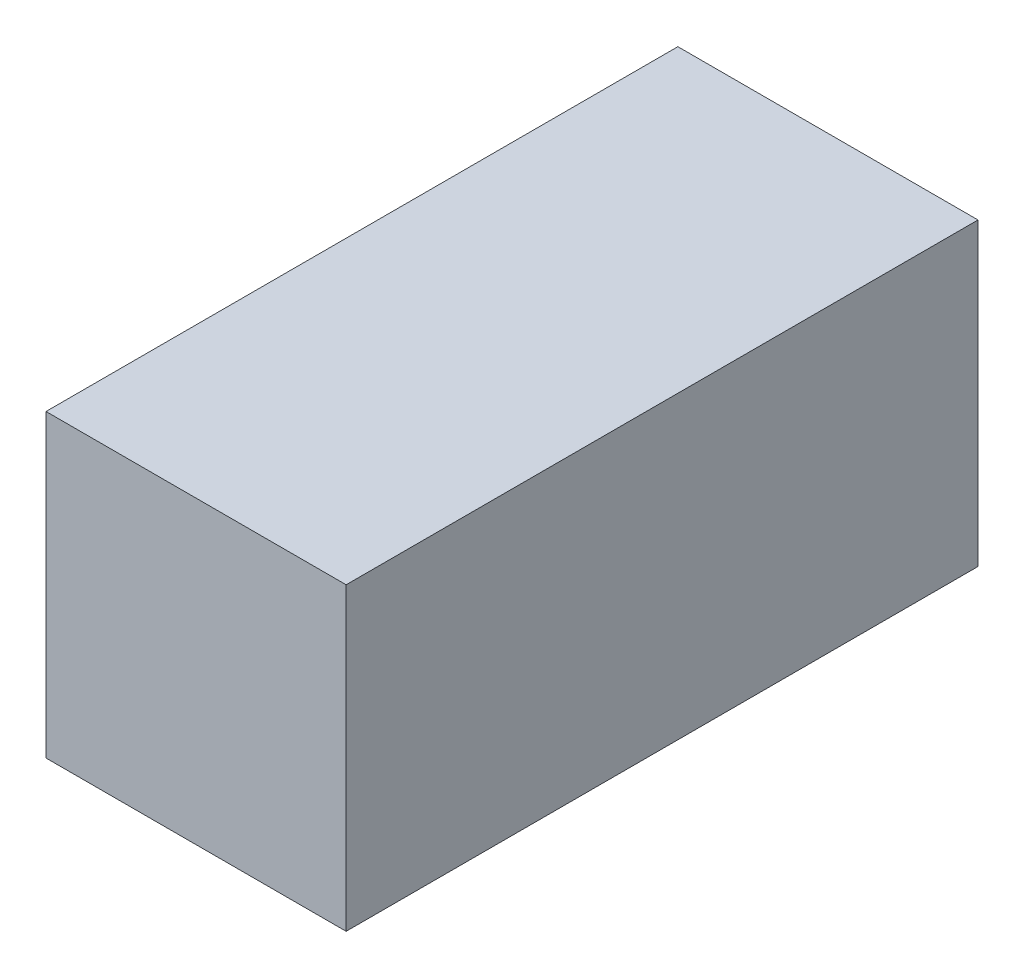
ISO-10303-21;
HEADER;
FILE_DESCRIPTION(('STEP AP214'),'2;1');
FILE_NAME('part.step','',(''),(''),'','','');
FILE_SCHEMA(('AUTOMOTIVE_DESIGN { 1 0 10303 214 1 1 1 1 }'));
ENDSEC;
DATA;
#1=APPLICATION_CONTEXT('core data for automotive mechanical design processes');
#2=APPLICATION_PROTOCOL_DEFINITION('international standard','automotive_design',2000,#1);
#3=PRODUCT_CONTEXT('',#1,'mechanical');
#4=PRODUCT('Part','Part','',(#3));
#5=PRODUCT_RELATED_PRODUCT_CATEGORY('part','',(#4));
#6=PRODUCT_DEFINITION_FORMATION('','',#4);
#7=PRODUCT_DEFINITION_CONTEXT('part definition',#1,'design');
#8=PRODUCT_DEFINITION('design','',#6,#7);
#9=PRODUCT_DEFINITION_SHAPE('','',#8);
#10=(LENGTH_UNIT() NAMED_UNIT(*) SI_UNIT(.MILLI.,.METRE.));
#11=(NAMED_UNIT(*) PLANE_ANGLE_UNIT() SI_UNIT($,.RADIAN.));
#12=(NAMED_UNIT(*) SI_UNIT($,.STERADIAN.) SOLID_ANGLE_UNIT());
#13=UNCERTAINTY_MEASURE_WITH_UNIT(LENGTH_MEASURE(1.E-05),#10,'distance_accuracy_value','');
#14=(GEOMETRIC_REPRESENTATION_CONTEXT(3) GLOBAL_UNCERTAINTY_ASSIGNED_CONTEXT((#13)) GLOBAL_UNIT_ASSIGNED_CONTEXT((#10,
#11,#12)) REPRESENTATION_CONTEXT('',''));
#15=CARTESIAN_POINT('',(0.,0.,0.));
#16=DIRECTION('',(0.,0.,1.));
#17=DIRECTION('',(1.,0.,0.));
#18=AXIS2_PLACEMENT_3D('',#15,#16,#17);
#19=CARTESIAN_POINT('',(6.65,6.65,28.));
#20=DIRECTION('',(-1.,0.,0.));
#21=DIRECTION('',(0.,-1.,0.));
#22=AXIS2_PLACEMENT_3D('',#19,#20,#21);
#23=PLANE('',#22);
#24=DIRECTION('',(0.,1.,0.));
#25=VECTOR('',#24,1.);
#26=CARTESIAN_POINT('',(6.65,6.65,0.));
#27=LINE('',#26,#25);
#28=CARTESIAN_POINT('',(6.65,-6.65,0.));
#29=VERTEX_POINT('',#28);
#30=CARTESIAN_POINT('',(6.65,6.65,0.));
#31=VERTEX_POINT('',#30);
#32=EDGE_CURVE('E98',#29,#31,#27,.T.);
#33=ORIENTED_EDGE('',*,*,#32,.T.);
#34=DIRECTION('',(0.,0.,-1.));
#35=VECTOR('',#34,1.);
#36=CARTESIAN_POINT('',(6.65,6.65,28.));
#37=LINE('',#36,#35);
#38=CARTESIAN_POINT('',(6.65,6.65,28.));
#39=VERTEX_POINT('',#38);
#40=EDGE_CURVE('E11',#39,#31,#37,.T.);
#41=ORIENTED_EDGE('',*,*,#40,.F.);
#42=DIRECTION('',(0.,1.,0.));
#43=VECTOR('',#42,1.);
#44=CARTESIAN_POINT('',(6.65,6.65,28.));
#45=LINE('',#44,#43);
#46=CARTESIAN_POINT('',(6.65,-6.65,28.));
#47=VERTEX_POINT('',#46);
#48=EDGE_CURVE('E86',#47,#39,#45,.T.);
#49=ORIENTED_EDGE('',*,*,#48,.F.);
#50=DIRECTION('',(0.,0.,-1.));
#51=VECTOR('',#50,1.);
#52=CARTESIAN_POINT('',(6.65,-6.65,28.));
#53=LINE('',#52,#51);
#54=EDGE_CURVE('E94',#47,#29,#53,.T.);
#55=ORIENTED_EDGE('',*,*,#54,.T.);
#56=EDGE_LOOP('',(#33,#41,#49,#55));
#57=FACE_BOUND('',#56,.T.);
#58=ADVANCED_FACE('F35',(#57),#23,.F.);
#59=CARTESIAN_POINT('',(-6.65,6.65,28.));
#60=DIRECTION('',(0.,-1.,0.));
#61=DIRECTION('',(0.,0.,-1.));
#62=AXIS2_PLACEMENT_3D('',#59,#60,#61);
#63=PLANE('',#62);
#64=DIRECTION('',(-1.,0.,0.));
#65=VECTOR('',#64,1.);
#66=CARTESIAN_POINT('',(-6.65,6.65,0.));
#67=LINE('',#66,#65);
#68=CARTESIAN_POINT('',(-6.65,6.65,0.));
#69=VERTEX_POINT('',#68);
#70=EDGE_CURVE('E90',#31,#69,#67,.T.);
#71=ORIENTED_EDGE('',*,*,#70,.T.);
#72=DIRECTION('',(0.,0.,-1.));
#73=VECTOR('',#72,1.);
#74=CARTESIAN_POINT('',(-6.65,6.65,28.));
#75=LINE('',#74,#73);
#76=CARTESIAN_POINT('',(-6.65,6.65,28.));
#77=VERTEX_POINT('',#76);
#78=EDGE_CURVE('E43',#77,#69,#75,.T.);
#79=ORIENTED_EDGE('',*,*,#78,.F.);
#80=DIRECTION('',(-1.,0.,0.));
#81=VECTOR('',#80,1.);
#82=CARTESIAN_POINT('',(-6.65,6.65,28.));
#83=LINE('',#82,#81);
#84=EDGE_CURVE('E81',#39,#77,#83,.T.);
#85=ORIENTED_EDGE('',*,*,#84,.F.);
#86=ORIENTED_EDGE('',*,*,#40,.T.);
#87=EDGE_LOOP('',(#71,#79,#85,#86));
#88=FACE_BOUND('',#87,.T.);
#89=ADVANCED_FACE('F89',(#88),#63,.F.);
#90=CARTESIAN_POINT('',(-6.65,6.65,28.));
#91=DIRECTION('',(1.,0.,0.));
#92=DIRECTION('',(0.,1.,0.));
#93=AXIS2_PLACEMENT_3D('',#90,#91,#92);
#94=PLANE('',#93);
#95=DIRECTION('',(0.,-1.,0.));
#96=VECTOR('',#95,1.);
#97=CARTESIAN_POINT('',(-6.65,6.65,0.));
#98=LINE('',#97,#96);
#99=CARTESIAN_POINT('',(-6.65,-6.65,0.));
#100=VERTEX_POINT('',#99);
#101=EDGE_CURVE('E68',#69,#100,#98,.T.);
#102=ORIENTED_EDGE('',*,*,#101,.T.);
#103=DIRECTION('',(0.,0.,-1.));
#104=VECTOR('',#103,1.);
#105=CARTESIAN_POINT('',(-6.65,-6.65,28.));
#106=LINE('',#105,#104);
#107=CARTESIAN_POINT('',(-6.65,-6.65,28.));
#108=VERTEX_POINT('',#107);
#109=EDGE_CURVE('E91',#108,#100,#106,.T.);
#110=ORIENTED_EDGE('',*,*,#109,.F.);
#111=DIRECTION('',(0.,-1.,0.));
#112=VECTOR('',#111,1.);
#113=CARTESIAN_POINT('',(-6.65,6.65,28.));
#114=LINE('',#113,#112);
#115=EDGE_CURVE('E84',#77,#108,#114,.T.);
#116=ORIENTED_EDGE('',*,*,#115,.F.);
#117=ORIENTED_EDGE('',*,*,#78,.T.);
#118=EDGE_LOOP('',(#102,#110,#116,#117));
#119=FACE_BOUND('',#118,.T.);
#120=ADVANCED_FACE('F92',(#119),#94,.F.);
#121=CARTESIAN_POINT('',(-6.65,-6.65,28.));
#122=DIRECTION('',(0.,1.,0.));
#123=DIRECTION('',(0.,0.,1.));
#124=AXIS2_PLACEMENT_3D('',#121,#122,#123);
#125=PLANE('',#124);
#126=DIRECTION('',(1.,0.,0.));
#127=VECTOR('',#126,1.);
#128=CARTESIAN_POINT('',(-6.65,-6.65,0.));
#129=LINE('',#128,#127);
#130=EDGE_CURVE('E74',#100,#29,#129,.T.);
#131=ORIENTED_EDGE('',*,*,#130,.T.);
#132=ORIENTED_EDGE('',*,*,#54,.F.);
#133=DIRECTION('',(1.,0.,0.));
#134=VECTOR('',#133,1.);
#135=CARTESIAN_POINT('',(-6.65,-6.65,28.));
#136=LINE('',#135,#134);
#137=EDGE_CURVE('E51',#108,#47,#136,.T.);
#138=ORIENTED_EDGE('',*,*,#137,.F.);
#139=ORIENTED_EDGE('',*,*,#109,.T.);
#140=EDGE_LOOP('',(#131,#132,#138,#139));
#141=FACE_BOUND('',#140,.T.);
#142=ADVANCED_FACE('F105',(#141),#125,.F.);
#143=CARTESIAN_POINT('',(0.,0.,28.));
#144=DIRECTION('',(0.,0.,1.));
#145=DIRECTION('',(1.,0.,0.));
#146=AXIS2_PLACEMENT_3D('',#143,#144,#145);
#147=PLANE('',#146);
#148=ORIENTED_EDGE('',*,*,#48,.T.);
#149=ORIENTED_EDGE('',*,*,#84,.T.);
#150=ORIENTED_EDGE('',*,*,#115,.T.);
#151=ORIENTED_EDGE('',*,*,#137,.T.);
#152=EDGE_LOOP('',(#148,#149,#150,#151));
#153=FACE_BOUND('',#152,.T.);
#154=ADVANCED_FACE('F82',(#153),#147,.T.);
#155=CARTESIAN_POINT('',(0.,0.,0.));
#156=DIRECTION('',(0.,0.,1.));
#157=DIRECTION('',(1.,0.,0.));
#158=AXIS2_PLACEMENT_3D('',#155,#156,#157);
#159=PLANE('',#158);
#160=ORIENTED_EDGE('',*,*,#32,.F.);
#161=ORIENTED_EDGE('',*,*,#130,.F.);
#162=ORIENTED_EDGE('',*,*,#101,.F.);
#163=ORIENTED_EDGE('',*,*,#70,.F.);
#164=EDGE_LOOP('',(#160,#161,#162,#163));
#165=FACE_BOUND('',#164,.T.);
#166=ADVANCED_FACE('F108',(#165),#159,.F.);
#167=CLOSED_SHELL('',(#58,#89,#120,#142,#154,#166));
#168=MANIFOLD_SOLID_BREP('B2',#167);
#169=ADVANCED_BREP_SHAPE_REPRESENTATION('',(#18,#168),#14);
#170=SHAPE_DEFINITION_REPRESENTATION(#9,#169);
ENDSEC;
END-ISO-10303-21;
